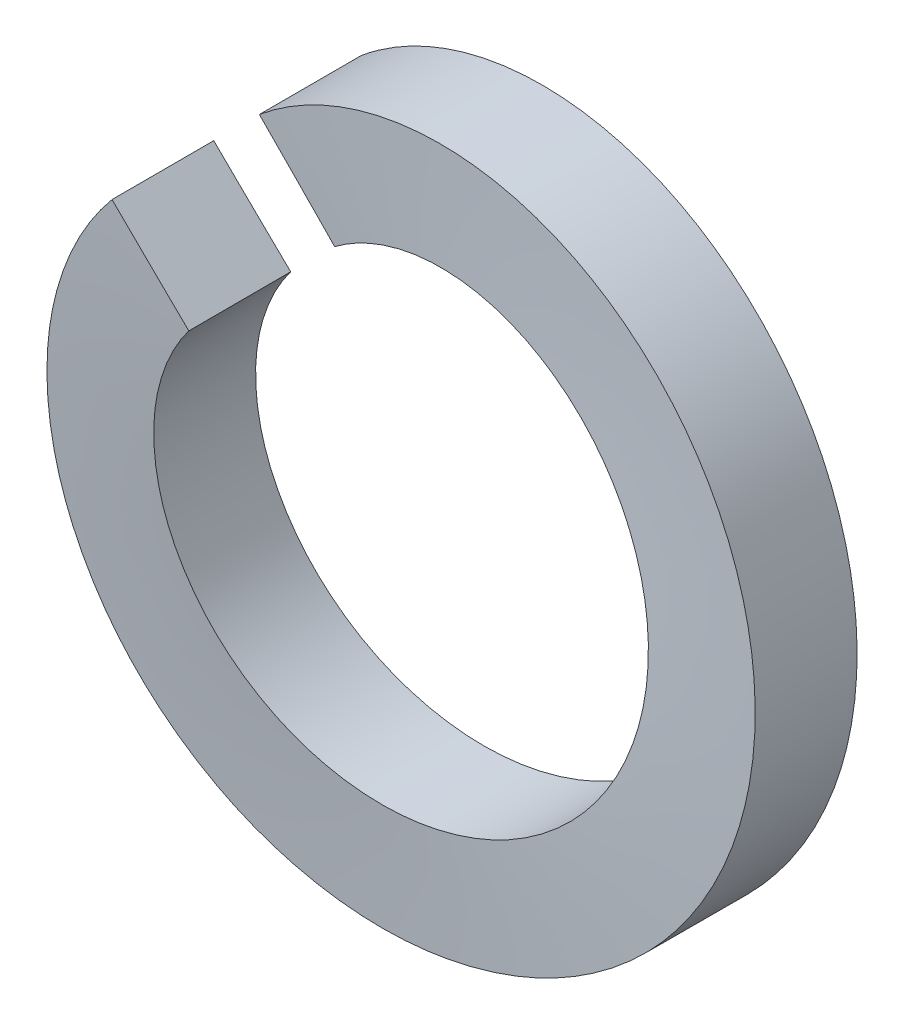
ISO-10303-21;
HEADER;
FILE_DESCRIPTION(('STEP AP214'),'2;1');
FILE_NAME('part.step','',(''),(''),'','','');
FILE_SCHEMA(('AUTOMOTIVE_DESIGN { 1 0 10303 214 1 1 1 1 }'));
ENDSEC;
DATA;
#1=APPLICATION_CONTEXT('core data for automotive mechanical design processes');
#2=APPLICATION_PROTOCOL_DEFINITION('international standard','automotive_design',2000,#1);
#3=PRODUCT_CONTEXT('',#1,'mechanical');
#4=PRODUCT('Part','Part','',(#3));
#5=PRODUCT_RELATED_PRODUCT_CATEGORY('part','',(#4));
#6=PRODUCT_DEFINITION_FORMATION('','',#4);
#7=PRODUCT_DEFINITION_CONTEXT('part definition',#1,'design');
#8=PRODUCT_DEFINITION('design','',#6,#7);
#9=PRODUCT_DEFINITION_SHAPE('','',#8);
#10=(LENGTH_UNIT() NAMED_UNIT(*) SI_UNIT(.MILLI.,.METRE.));
#11=(NAMED_UNIT(*) PLANE_ANGLE_UNIT() SI_UNIT($,.RADIAN.));
#12=(NAMED_UNIT(*) SI_UNIT($,.STERADIAN.) SOLID_ANGLE_UNIT());
#13=UNCERTAINTY_MEASURE_WITH_UNIT(LENGTH_MEASURE(1.E-05),#10,'distance_accuracy_value','');
#14=(GEOMETRIC_REPRESENTATION_CONTEXT(3) GLOBAL_UNCERTAINTY_ASSIGNED_CONTEXT((#13)) GLOBAL_UNIT_ASSIGNED_CONTEXT((#10,
#11,#12)) REPRESENTATION_CONTEXT('',''));
#15=CARTESIAN_POINT('',(0.,0.,0.));
#16=DIRECTION('',(0.,0.,1.));
#17=DIRECTION('',(1.,0.,0.));
#18=AXIS2_PLACEMENT_3D('',#15,#16,#17);
#19=CARTESIAN_POINT('',(-12.9046987566544,12.9046987566546,6.3));
#20=CARTESIAN_POINT('',(-15.8501120368315,9.95928547647756,6.075));
#21=CARTESIAN_POINT('',(-17.2258707781276,6.02759288068195,5.85));
#22=CARTESIAN_POINT('',(-18.6016295194238,2.09590028488634,5.625));
#23=CARTESIAN_POINT('',(-18.1352478305517,-2.04335168888521,5.4));
#24=CARTESIAN_POINT('',(-17.6688661416795,-6.18260366265676,5.175));
#25=CARTESIAN_POINT('',(-15.4527166359163,-9.70958539640476,4.95));
#26=CARTESIAN_POINT('',(-13.236567130153,-13.2365671301528,4.725));
#27=CARTESIAN_POINT('',(-9.70958539640502,-15.4527166359161,4.5));
#28=CARTESIAN_POINT('',(-6.18260366265706,-17.6688661416794,4.275));
#29=CARTESIAN_POINT('',(-2.04335168888553,-18.1352478305517,4.05));
#30=CARTESIAN_POINT('',(2.09590028488601,-18.6016295194239,3.825));
#31=CARTESIAN_POINT('',(6.02759288068165,-17.2258707781278,3.6));
#32=CARTESIAN_POINT('',(9.95928547647728,-15.8501120368316,3.375));
#33=CARTESIAN_POINT('',(12.9046987566544,-12.9046987566546,3.15));
#34=CARTESIAN_POINT('',(15.8501120368315,-9.95928547647756,2.925));
#35=CARTESIAN_POINT('',(17.2258707781276,-6.02759288068195,2.7));
#36=CARTESIAN_POINT('',(18.6016295194238,-2.09590028488634,2.475));
#37=CARTESIAN_POINT('',(18.1352478305517,2.04335168888521,2.25));
#38=CARTESIAN_POINT('',(17.6688661416795,6.18260366265675,2.025));
#39=CARTESIAN_POINT('',(15.4527166359163,9.70958539640475,1.8));
#40=CARTESIAN_POINT('',(13.236567130153,13.2365671301528,1.575));
#41=CARTESIAN_POINT('',(9.70958539640502,15.4527166359161,1.35));
#42=CARTESIAN_POINT('',(6.18260366265707,17.6688661416794,1.125));
#43=CARTESIAN_POINT('',(2.04335168888553,18.1352478305517,0.899999999999999));
#44=CARTESIAN_POINT('',(-2.09590028488601,18.6016295194239,0.674999999999999));
#45=CARTESIAN_POINT('',(-6.02759288068165,17.2258707781278,0.449999999999999));
#46=CARTESIAN_POINT('',(-9.95928547647728,15.8501120368316,0.225));
#47=CARTESIAN_POINT('',(-12.9046987566544,12.9046987566546,0.));
#48=CARTESIAN_POINT('',(-8.66205806953513,8.66205806953528,6.3));
#49=CARTESIAN_POINT('',(-10.6391162986951,6.68499984037535,6.075));
#50=CARTESIAN_POINT('',(-11.5625707962775,4.0459185089509,5.85));
#51=CARTESIAN_POINT('',(-12.4860252938598,1.40683717752645,5.625));
#52=CARTESIAN_POINT('',(-12.1729745711922,-1.37156483226541,5.4));
#53=CARTESIAN_POINT('',(-11.8599238485246,-4.14996684205727,5.175));
#54=CARTESIAN_POINT('',(-10.3723714405465,-6.51739293731278,4.95));
#55=CARTESIAN_POINT('',(-8.88481903256844,-8.88481903256828,4.725));
#56=CARTESIAN_POINT('',(-6.51739293731296,-10.3723714405464,4.5));
#57=CARTESIAN_POINT('',(-4.14996684205748,-11.8599238485246,4.275));
#58=CARTESIAN_POINT('',(-1.37156483226563,-12.1729745711922,4.05));
#59=CARTESIAN_POINT('',(1.40683717752622,-12.4860252938599,3.825));
#60=CARTESIAN_POINT('',(4.04591850895069,-11.5625707962775,3.6));
#61=CARTESIAN_POINT('',(6.68499984037516,-10.6391162986952,3.375));
#62=CARTESIAN_POINT('',(8.66205806953512,-8.66205806953528,3.15));
#63=CARTESIAN_POINT('',(10.6391162986951,-6.68499984037535,2.925));
#64=CARTESIAN_POINT('',(11.5625707962775,-4.0459185089509,2.7));
#65=CARTESIAN_POINT('',(12.4860252938598,-1.40683717752645,2.475));
#66=CARTESIAN_POINT('',(12.1729745711922,1.37156483226541,2.25));
#67=CARTESIAN_POINT('',(11.8599238485246,4.14996684205727,2.025));
#68=CARTESIAN_POINT('',(10.3723714405465,6.51739293731278,1.8));
#69=CARTESIAN_POINT('',(8.88481903256844,8.88481903256828,1.575));
#70=CARTESIAN_POINT('',(6.51739293731296,10.3723714405464,1.35));
#71=CARTESIAN_POINT('',(4.14996684205748,11.8599238485246,1.125));
#72=CARTESIAN_POINT('',(1.37156483226563,12.1729745711922,0.9));
#73=CARTESIAN_POINT('',(-1.40683717752622,12.4860252938599,0.675));
#74=CARTESIAN_POINT('',(-4.04591850895069,11.5625707962775,0.45));
#75=CARTESIAN_POINT('',(-6.68499984037516,10.6391162986952,0.225));
#76=CARTESIAN_POINT('',(-8.66205806953513,8.66205806953528,0.));
#77=(BOUNDED_SURFACE() B_SPLINE_SURFACE(1,2,((#19,#20,#21,#22,#23,#24,#25,#26,#27,#28,#29,#30,
#31,#32,#33,#34,#35,#36,#37,#38,#39,#40,#41,#42,#43,#44,#45,#46,#47),(#48,#49,#50,#51,#52,#53,
#54,#55,#56,#57,#58,#59,#60,#61,#62,#63,#64,#65,#66,#67,#68,#69,#70,#71,#72,#73,#74,#75,#76)),
.UNSPECIFIED.,.F.,.F.,.F.) B_SPLINE_SURFACE_WITH_KNOTS((2,2),(3,2,2,2,2,2,2,2,2,2,2,2,2,2,3),
(0.,0.256410256410256),(0.,0.0714285714285714,0.142857142857143,0.214285714285714,
0.285714285714286,0.357142857142857,0.428571428571429,0.5,0.571428571428571,0.642857142857143,
0.714285714285714,0.785714285714286,0.857142857142857,0.928571428571429,1.),
.UNSPECIFIED.) GEOMETRIC_REPRESENTATION_ITEM() RATIONAL_B_SPLINE_SURFACE(((1.,0.974927912181824,
1.,0.974927912181824,1.,0.974927912181824,1.,0.974927912181824,1.,0.974927912181824,1.,
0.974927912181824,1.,0.974927912181824,1.,0.974927912181824,1.,0.974927912181824,1.,
0.974927912181824,1.,0.974927912181824,1.,0.974927912181824,1.,0.974927912181824,1.,
0.974927912181824,1.),(1.,0.974927912181824,1.,0.974927912181824,1.,0.974927912181824,1.,
0.974927912181824,1.,0.974927912181824,1.,0.974927912181824,1.,0.974927912181824,1.,
0.974927912181824,1.,0.974927912181824,1.,0.974927912181824,1.,0.974927912181824,1.,
0.974927912181824,1.,0.974927912181824,1.,0.974927912181824,1.))) REPRESENTATION_ITEM('') SURFACE());
#78=CARTESIAN_POINT('',(-8.66205806953513,8.66205806953528,6.3));
#79=CARTESIAN_POINT('',(-10.6391162986951,6.68499984037535,6.075));
#80=CARTESIAN_POINT('',(-11.5625707962775,4.0459185089509,5.85));
#81=CARTESIAN_POINT('',(-12.4860252938598,1.40683717752645,5.625));
#82=CARTESIAN_POINT('',(-12.1729745711922,-1.37156483226541,5.4));
#83=CARTESIAN_POINT('',(-11.8599238485246,-4.14996684205727,5.175));
#84=CARTESIAN_POINT('',(-10.3723714405465,-6.51739293731278,4.95));
#85=CARTESIAN_POINT('',(-8.88481903256844,-8.88481903256828,4.725));
#86=CARTESIAN_POINT('',(-6.51739293731296,-10.3723714405464,4.5));
#87=CARTESIAN_POINT('',(-4.14996684205748,-11.8599238485246,4.275));
#88=CARTESIAN_POINT('',(-1.37156483226563,-12.1729745711922,4.05));
#89=CARTESIAN_POINT('',(1.40683717752622,-12.4860252938599,3.825));
#90=CARTESIAN_POINT('',(4.04591850895069,-11.5625707962775,3.6));
#91=CARTESIAN_POINT('',(6.68499984037516,-10.6391162986952,3.375));
#92=CARTESIAN_POINT('',(8.66205806953512,-8.66205806953528,3.15));
#93=CARTESIAN_POINT('',(10.6391162986951,-6.68499984037535,2.925));
#94=CARTESIAN_POINT('',(11.5625707962775,-4.0459185089509,2.7));
#95=CARTESIAN_POINT('',(12.4860252938598,-1.40683717752645,2.475));
#96=CARTESIAN_POINT('',(12.1729745711922,1.37156483226541,2.25));
#97=CARTESIAN_POINT('',(11.8599238485246,4.14996684205727,2.025));
#98=CARTESIAN_POINT('',(10.3723714405465,6.51739293731278,1.8));
#99=CARTESIAN_POINT('',(8.88481903256844,8.88481903256828,1.575));
#100=CARTESIAN_POINT('',(6.51739293731296,10.3723714405464,1.35));
#101=CARTESIAN_POINT('',(4.14996684205748,11.8599238485246,1.125));
#102=CARTESIAN_POINT('',(1.37156483226563,12.1729745711922,0.9));
#103=CARTESIAN_POINT('',(-1.40683717752622,12.4860252938599,0.675));
#104=CARTESIAN_POINT('',(-4.04591850895069,11.5625707962775,0.45));
#105=CARTESIAN_POINT('',(-6.68499984037516,10.6391162986952,0.225));
#106=CARTESIAN_POINT('',(-8.66205806953513,8.66205806953528,0.));
#107=(BOUNDED_CURVE() B_SPLINE_CURVE(2,(#78,#79,#80,#81,#82,#83,#84,#85,#86,#87,#88,#89,#90,#91,
#92,#93,#94,#95,#96,#97,#98,#99,#100,#101,#102,#103,#104,#105,#106),.UNSPECIFIED.,.F.,
.F.) B_SPLINE_CURVE_WITH_KNOTS((3,2,2,2,2,2,2,2,2,2,2,2,2,2,3),(0.,0.0714285714285714,
0.142857142857143,0.214285714285714,0.285714285714286,0.357142857142857,0.428571428571429,0.5,
0.571428571428571,0.642857142857143,0.714285714285714,0.785714285714286,0.857142857142857,
0.928571428571429,1.),
.UNSPECIFIED.) CURVE() GEOMETRIC_REPRESENTATION_ITEM() RATIONAL_B_SPLINE_CURVE((1.,
0.974927912181824,1.,0.974927912181824,1.,0.974927912181824,1.,0.974927912181824,1.,
0.974927912181824,1.,0.974927912181824,1.,0.974927912181824,1.,0.974927912181824,1.,
0.974927912181824,1.,0.974927912181824,1.,0.974927912181824,1.,0.974927912181824,1.,
0.974927912181824,1.,0.974927912181824,1.)) REPRESENTATION_ITEM(''));
#108=CARTESIAN_POINT('',(-9.65753460380452,7.53621426024487,6.17759792475585));
#109=VERTEX_POINT('',#108);
#110=CARTESIAN_POINT('',(-7.53621426024487,9.65753460380451,0.122402075244133));
#111=VERTEX_POINT('',#110);
#112=EDGE_CURVE('E52',#109,#111,#107,.T.);
#113=CARTESIAN_POINT('',(-9.65753460380452,7.53621426024487,6.17759792475585));
#114=CARTESIAN_POINT('',(-10.0201626185838,7.89884227502415,6.18273019748663));
#115=CARTESIAN_POINT('',(-10.3827944525156,8.26147410895596,6.18726637702038));
#116=CARTESIAN_POINT('',(-11.1080632384221,8.98674289486242,6.19541822317271));
#117=CARTESIAN_POINT('',(-11.4707001903951,9.34937984683546,6.19903389007709));
#118=CARTESIAN_POINT('',(-12.1813962576839,10.0600759141242,6.20548405553128));
#119=CARTESIAN_POINT('',(-12.5294552617778,10.4081349182182,6.20834411749943));
#120=CARTESIAN_POINT('',(-13.2255747812567,11.104254437697,6.2135971687636));
#121=CARTESIAN_POINT('',(-13.5736352966402,11.4523149530806,6.21599015841606));
#122=CARTESIAN_POINT('',(-13.9216962886718,11.8003759451122,6.21821493248272));
#123=B_SPLINE_CURVE_WITH_KNOTS('',3,(#113,#114,#115,#116,#117,#118,#119,#120,#121,#122),
.UNSPECIFIED.,.F.,.F.,(4,2,2,2,4),(0.,1.53857626231134,3.07715204690481,4.55386606482436,
6.03057895579324),.UNSPECIFIED.);
#124=CARTESIAN_POINT('',(-13.9216962886718,11.8003759451122,6.21821493248272));
#125=VERTEX_POINT('',#124);
#126=EDGE_CURVE('E109',#109,#125,#123,.T.);
#127=CARTESIAN_POINT('',(-12.9046987566544,12.9046987566546,6.3));
#128=CARTESIAN_POINT('',(-15.8501120368315,9.95928547647756,6.075));
#129=CARTESIAN_POINT('',(-17.2258707781276,6.02759288068195,5.85));
#130=CARTESIAN_POINT('',(-18.6016295194238,2.09590028488634,5.625));
#131=CARTESIAN_POINT('',(-18.1352478305517,-2.04335168888521,5.4));
#132=CARTESIAN_POINT('',(-17.6688661416795,-6.18260366265676,5.175));
#133=CARTESIAN_POINT('',(-15.4527166359163,-9.70958539640476,4.95));
#134=CARTESIAN_POINT('',(-13.236567130153,-13.2365671301528,4.725));
#135=CARTESIAN_POINT('',(-9.70958539640502,-15.4527166359161,4.5));
#136=CARTESIAN_POINT('',(-6.18260366265706,-17.6688661416794,4.275));
#137=CARTESIAN_POINT('',(-2.04335168888553,-18.1352478305517,4.05));
#138=CARTESIAN_POINT('',(2.09590028488601,-18.6016295194239,3.825));
#139=CARTESIAN_POINT('',(6.02759288068165,-17.2258707781278,3.6));
#140=CARTESIAN_POINT('',(9.95928547647728,-15.8501120368316,3.375));
#141=CARTESIAN_POINT('',(12.9046987566544,-12.9046987566546,3.15));
#142=CARTESIAN_POINT('',(15.8501120368315,-9.95928547647756,2.925));
#143=CARTESIAN_POINT('',(17.2258707781276,-6.02759288068195,2.7));
#144=CARTESIAN_POINT('',(18.6016295194238,-2.09590028488634,2.475));
#145=CARTESIAN_POINT('',(18.1352478305517,2.04335168888521,2.25));
#146=CARTESIAN_POINT('',(17.6688661416795,6.18260366265675,2.025));
#147=CARTESIAN_POINT('',(15.4527166359163,9.70958539640475,1.8));
#148=CARTESIAN_POINT('',(13.236567130153,13.2365671301528,1.575));
#149=CARTESIAN_POINT('',(9.70958539640502,15.4527166359161,1.35));
#150=CARTESIAN_POINT('',(6.18260366265707,17.6688661416794,1.125));
#151=CARTESIAN_POINT('',(2.04335168888553,18.1352478305517,0.899999999999999));
#152=CARTESIAN_POINT('',(-2.09590028488601,18.6016295194239,0.674999999999999));
#153=CARTESIAN_POINT('',(-6.02759288068165,17.2258707781278,0.449999999999999));
#154=CARTESIAN_POINT('',(-9.95928547647728,15.8501120368316,0.225));
#155=CARTESIAN_POINT('',(-12.9046987566544,12.9046987566546,0.));
#156=(BOUNDED_CURVE() B_SPLINE_CURVE(2,(#127,#128,#129,#130,#131,#132,#133,#134,#135,#136,#137,
#138,#139,#140,#141,#142,#143,#144,#145,#146,#147,#148,#149,#150,#151,#152,#153,#154,#155),
.UNSPECIFIED.,.F.,.F.) B_SPLINE_CURVE_WITH_KNOTS((3,2,2,2,2,2,2,2,2,2,2,2,2,2,3),(0.,
0.0714285714285714,0.142857142857143,0.214285714285714,0.285714285714286,0.357142857142857,
0.428571428571429,0.5,0.571428571428571,0.642857142857143,0.714285714285714,0.785714285714286,
0.857142857142857,0.928571428571429,1.),
.UNSPECIFIED.) CURVE() GEOMETRIC_REPRESENTATION_ITEM() RATIONAL_B_SPLINE_CURVE((1.,
0.974927912181824,1.,0.974927912181824,1.,0.974927912181824,1.,0.974927912181824,1.,
0.974927912181824,1.,0.974927912181824,1.,0.974927912181824,1.,0.974927912181824,1.,
0.974927912181824,1.,0.974927912181824,1.,0.974927912181824,1.,0.974927912181824,1.,
0.974927912181824,1.,0.974927912181824,1.)) REPRESENTATION_ITEM(''));
#157=CARTESIAN_POINT('',(-11.8003759451121,13.9216962886718,0.0817850675172687));
#158=VERTEX_POINT('',#157);
#159=EDGE_CURVE('E107',#125,#158,#156,.T.);
#160=CARTESIAN_POINT('',(-11.8003759451122,13.9216962886718,0.0817850675172652));
#161=CARTESIAN_POINT('',(-11.4377339800159,13.5590543235756,0.0841045315764204));
#162=CARTESIAN_POINT('',(-11.0750925055633,13.196412849123,0.0866044232967273));
#163=CARTESIAN_POINT('',(-10.3498115016624,12.471131845222,0.0921172383524553));
#164=CARTESIAN_POINT('',(-9.98717197221422,12.1084923157739,0.0951301617199858));
#165=CARTESIAN_POINT('',(-9.27647663980695,11.3977969833666,0.101686700799431));
#166=CARTESIAN_POINT('',(-8.92842072045813,11.0497410640178,0.105204107871125));
#167=CARTESIAN_POINT('',(-8.23231343468733,10.353633778247,0.113097605846447));
#168=CARTESIAN_POINT('',(-7.88426206827054,10.0055824118302,0.117473697653337));
#169=CARTESIAN_POINT('',(-7.53621426024487,9.65753460380452,0.122402075244134));
#170=B_SPLINE_CURVE_WITH_KNOTS('',3,(#160,#161,#162,#163,#164,#165,#166,#167,#168,#169),
.UNSPECIFIED.,.F.,.F.,(4,2,2,2,4),(0.,1.53857542804319,3.07715095238217,4.55386418909776,
6.03057897919404),.UNSPECIFIED.);
#171=EDGE_CURVE('E66',#158,#111,#170,.T.);
#172=ORIENTED_EDGE('',*,*,#112,.F.);
#173=ORIENTED_EDGE('',*,*,#126,.T.);
#174=ORIENTED_EDGE('',*,*,#159,.T.);
#175=ORIENTED_EDGE('',*,*,#171,.T.);
#176=EDGE_LOOP('',(#172,#173,#174,#175));
#177=FACE_BOUND('',#176,.T.);
#178=ADVANCED_FACE('F46',(#177),#77,.F.);
#179=CARTESIAN_POINT('',(-8.66205806953513,8.66205806953528,6.3));
#180=CARTESIAN_POINT('',(-10.6391162986951,6.68499984037535,6.075));
#181=CARTESIAN_POINT('',(-11.5625707962775,4.0459185089509,5.85));
#182=CARTESIAN_POINT('',(-12.4860252938598,1.40683717752645,5.625));
#183=CARTESIAN_POINT('',(-12.1729745711922,-1.37156483226541,5.4));
#184=CARTESIAN_POINT('',(-11.8599238485246,-4.14996684205727,5.175));
#185=CARTESIAN_POINT('',(-10.3723714405465,-6.51739293731278,4.95));
#186=CARTESIAN_POINT('',(-8.88481903256844,-8.88481903256828,4.725));
#187=CARTESIAN_POINT('',(-6.51739293731296,-10.3723714405464,4.5));
#188=CARTESIAN_POINT('',(-4.14996684205748,-11.8599238485246,4.275));
#189=CARTESIAN_POINT('',(-1.37156483226563,-12.1729745711922,4.05));
#190=CARTESIAN_POINT('',(1.40683717752622,-12.4860252938599,3.825));
#191=CARTESIAN_POINT('',(4.04591850895069,-11.5625707962775,3.6));
#192=CARTESIAN_POINT('',(6.68499984037516,-10.6391162986952,3.375));
#193=CARTESIAN_POINT('',(8.66205806953512,-8.66205806953528,3.15));
#194=CARTESIAN_POINT('',(10.6391162986951,-6.68499984037535,2.925));
#195=CARTESIAN_POINT('',(11.5625707962775,-4.0459185089509,2.7));
#196=CARTESIAN_POINT('',(12.4860252938598,-1.40683717752645,2.475));
#197=CARTESIAN_POINT('',(12.1729745711922,1.37156483226541,2.25));
#198=CARTESIAN_POINT('',(11.8599238485246,4.14996684205727,2.025));
#199=CARTESIAN_POINT('',(10.3723714405465,6.51739293731278,1.8));
#200=CARTESIAN_POINT('',(8.88481903256844,8.88481903256828,1.575));
#201=CARTESIAN_POINT('',(6.51739293731296,10.3723714405464,1.35));
#202=CARTESIAN_POINT('',(4.14996684205748,11.8599238485246,1.125));
#203=CARTESIAN_POINT('',(1.37156483226563,12.1729745711922,0.9));
#204=CARTESIAN_POINT('',(-1.40683717752622,12.4860252938599,0.675));
#205=CARTESIAN_POINT('',(-4.04591850895069,11.5625707962775,0.45));
#206=CARTESIAN_POINT('',(-6.68499984037516,10.6391162986952,0.225));
#207=CARTESIAN_POINT('',(-8.66205806953513,8.66205806953528,0.));
#208=CARTESIAN_POINT('',(-8.33325603120936,8.99086010786103,0.618998465130849));
#209=CARTESIAN_POINT('',(-10.3853611799834,7.08884879831514,0.393998465130849));
#210=CARTESIAN_POINT('',(-11.4089922538613,4.48482076700352,0.168998465130849));
#211=CARTESIAN_POINT('',(-12.4326233277393,1.8807927356919,-0.0560015348691513));
#212=CARTESIAN_POINT('',(-12.2250376385285,-0.9094923294762,-0.281001534869151));
#213=CARTESIAN_POINT('',(-12.0174519493176,-3.6997773946443,-0.506001534869151));
#214=CARTESIAN_POINT('',(-10.6197643886376,-6.12366931591173,-0.731001534869151));
#215=CARTESIAN_POINT('',(-9.22207682795755,-8.54756123717916,-0.956001534869151));
#216=CARTESIAN_POINT('',(-6.911116558714,-10.1249784924553,-1.18100153486915));
#217=CARTESIAN_POINT('',(-4.60015628947046,-11.7023957477315,-1.40600153486915));
#218=CARTESIAN_POINT('',(-1.83363733505484,-12.1209115038559,-1.63100153486915));
#219=CARTESIAN_POINT('',(0.932881619360775,-12.5394272599803,-1.85600153486915));
#220=CARTESIAN_POINT('',(3.60701625089807,-11.7161493386936,-2.08100153486915));
#221=CARTESIAN_POINT('',(6.28115088243536,-10.8928714174069,-2.30600153486915));
#222=CARTESIAN_POINT('',(8.33325603120936,-8.99086010786103,-2.53100153486915));
#223=CARTESIAN_POINT('',(10.3853611799834,-7.08884879831514,-2.75600153486915));
#224=CARTESIAN_POINT('',(11.4089922538613,-4.48482076700352,-2.98100153486915));
#225=CARTESIAN_POINT('',(12.4326233277393,-1.8807927356919,-3.20600153486915));
#226=CARTESIAN_POINT('',(12.2250376385285,0.909492329476199,-3.43100153486915));
#227=CARTESIAN_POINT('',(12.0174519493176,3.69977739464429,-3.65600153486915));
#228=CARTESIAN_POINT('',(10.6197643886376,6.12366931591173,-3.88100153486915));
#229=CARTESIAN_POINT('',(9.22207682795756,8.54756123717916,-4.10600153486915));
#230=CARTESIAN_POINT('',(6.911116558714,10.1249784924553,-4.33100153486915));
#231=CARTESIAN_POINT('',(4.60015628947046,11.7023957477315,-4.55600153486915));
#232=CARTESIAN_POINT('',(1.83363733505484,12.1209115038559,-4.78100153486915));
#233=CARTESIAN_POINT('',(-0.932881619360774,12.5394272599803,-5.00600153486915));
#234=CARTESIAN_POINT('',(-3.60701625089807,11.7161493386936,-5.23100153486915));
#235=CARTESIAN_POINT('',(-6.28115088243536,10.8928714174069,-5.45600153486915));
#236=CARTESIAN_POINT('',(-8.33325603120936,8.99086010786103,-5.68100153486915));
#237=(BOUNDED_SURFACE() B_SPLINE_SURFACE(1,2,((#179,#180,#181,#182,#183,#184,#185,#186,#187,
#188,#189,#190,#191,#192,#193,#194,#195,#196,#197,#198,#199,#200,#201,#202,#203,#204,#205,#206,
#207),(#208,#209,#210,#211,#212,#213,#214,#215,#216,#217,#218,#219,#220,#221,#222,#223,#224,
#225,#226,#227,#228,#229,#230,#231,#232,#233,#234,#235,#236)),.UNSPECIFIED.,.F.,.F.,
.F.) B_SPLINE_SURFACE_WITH_KNOTS((2,2),(3,2,2,2,2,2,2,2,2,2,2,2,2,2,3),(0.256410256410256,0.5),
(0.,0.0714285714285714,0.142857142857143,0.214285714285714,0.285714285714286,0.357142857142857,
0.428571428571429,0.5,0.571428571428571,0.642857142857143,0.714285714285714,0.785714285714286,
0.857142857142857,0.928571428571429,1.),
.UNSPECIFIED.) GEOMETRIC_REPRESENTATION_ITEM() RATIONAL_B_SPLINE_SURFACE(((1.,0.974927912181824,
1.,0.974927912181824,1.,0.974927912181824,1.,0.974927912181824,1.,0.974927912181824,1.,
0.974927912181824,1.,0.974927912181824,1.,0.974927912181824,1.,0.974927912181824,1.,
0.974927912181824,1.,0.974927912181824,1.,0.974927912181824,1.,0.974927912181824,1.,
0.974927912181824,1.),(1.,0.974927912181824,1.,0.974927912181824,1.,0.974927912181824,1.,
0.974927912181824,1.,0.974927912181824,1.,0.974927912181824,1.,0.974927912181824,1.,
0.974927912181824,1.,0.974927912181824,1.,0.974927912181824,1.,0.974927912181824,1.,
0.974927912181824,1.,0.974927912181824,1.,0.974927912181824,1.))) REPRESENTATION_ITEM('') SURFACE());
#238=CARTESIAN_POINT('',(-8.33325603120936,8.99086010786103,0.618998465130849));
#239=CARTESIAN_POINT('',(-10.3853611799834,7.08884879831514,0.393998465130849));
#240=CARTESIAN_POINT('',(-11.4089922538613,4.48482076700352,0.168998465130849));
#241=CARTESIAN_POINT('',(-12.4326233277393,1.8807927356919,-0.0560015348691513));
#242=CARTESIAN_POINT('',(-12.2250376385285,-0.9094923294762,-0.281001534869151));
#243=CARTESIAN_POINT('',(-12.0174519493176,-3.6997773946443,-0.506001534869151));
#244=CARTESIAN_POINT('',(-10.6197643886376,-6.12366931591173,-0.731001534869151));
#245=CARTESIAN_POINT('',(-9.22207682795755,-8.54756123717916,-0.956001534869151));
#246=CARTESIAN_POINT('',(-6.911116558714,-10.1249784924553,-1.18100153486915));
#247=CARTESIAN_POINT('',(-4.60015628947046,-11.7023957477315,-1.40600153486915));
#248=CARTESIAN_POINT('',(-1.83363733505484,-12.1209115038559,-1.63100153486915));
#249=CARTESIAN_POINT('',(0.932881619360775,-12.5394272599803,-1.85600153486915));
#250=CARTESIAN_POINT('',(3.60701625089807,-11.7161493386936,-2.08100153486915));
#251=CARTESIAN_POINT('',(6.28115088243536,-10.8928714174069,-2.30600153486915));
#252=CARTESIAN_POINT('',(8.33325603120936,-8.99086010786103,-2.53100153486915));
#253=CARTESIAN_POINT('',(10.3853611799834,-7.08884879831514,-2.75600153486915));
#254=CARTESIAN_POINT('',(11.4089922538613,-4.48482076700352,-2.98100153486915));
#255=CARTESIAN_POINT('',(12.4326233277393,-1.8807927356919,-3.20600153486915));
#256=CARTESIAN_POINT('',(12.2250376385285,0.909492329476199,-3.43100153486915));
#257=CARTESIAN_POINT('',(12.0174519493176,3.69977739464429,-3.65600153486915));
#258=CARTESIAN_POINT('',(10.6197643886376,6.12366931591173,-3.88100153486915));
#259=CARTESIAN_POINT('',(9.22207682795756,8.54756123717916,-4.10600153486915));
#260=CARTESIAN_POINT('',(6.911116558714,10.1249784924553,-4.33100153486915));
#261=CARTESIAN_POINT('',(4.60015628947046,11.7023957477315,-4.55600153486915));
#262=CARTESIAN_POINT('',(1.83363733505484,12.1209115038559,-4.78100153486915));
#263=CARTESIAN_POINT('',(-0.932881619360774,12.5394272599803,-5.00600153486915));
#264=CARTESIAN_POINT('',(-3.60701625089807,11.7161493386936,-5.23100153486915));
#265=CARTESIAN_POINT('',(-6.28115088243536,10.8928714174069,-5.45600153486915));
#266=CARTESIAN_POINT('',(-8.33325603120936,8.99086010786103,-5.68100153486915));
#267=(BOUNDED_CURVE() B_SPLINE_CURVE(2,(#238,#239,#240,#241,#242,#243,#244,#245,#246,#247,#248,
#249,#250,#251,#252,#253,#254,#255,#256,#257,#258,#259,#260,#261,#262,#263,#264,#265,#266),
.UNSPECIFIED.,.F.,.F.) B_SPLINE_CURVE_WITH_KNOTS((3,2,2,2,2,2,2,2,2,2,2,2,2,2,3),(0.,
0.0714285714285714,0.142857142857143,0.214285714285714,0.285714285714286,0.357142857142857,
0.428571428571429,0.5,0.571428571428571,0.642857142857143,0.714285714285714,0.785714285714286,
0.857142857142857,0.928571428571429,1.),
.UNSPECIFIED.) CURVE() GEOMETRIC_REPRESENTATION_ITEM() RATIONAL_B_SPLINE_CURVE((1.,
0.974927912181824,1.,0.974927912181824,1.,0.974927912181824,1.,0.974927912181824,1.,
0.974927912181824,1.,0.974927912181824,1.,0.974927912181824,1.,0.974927912181824,1.,
0.974927912181824,1.,0.974927912181824,1.,0.974927912181824,1.,0.974927912181824,1.,
0.974927912181824,1.,0.974927912181824,1.)) REPRESENTATION_ITEM(''));
#268=CARTESIAN_POINT('',(-9.6638201017362,7.54249975817656,0.45845594869544));
#269=VERTEX_POINT('',#268);
#270=CARTESIAN_POINT('',(-7.54249975817656,9.6638201017362,-5.5967707305064));
#271=VERTEX_POINT('',#270);
#272=EDGE_CURVE('E103',#269,#271,#267,.T.);
#273=CARTESIAN_POINT('',(-9.6638201017362,7.54249975817656,0.45845594869544));
#274=CARTESIAN_POINT('',(-9.66277286413735,7.5414525205777,0.935048850950928));
#275=CARTESIAN_POINT('',(-9.66185638889622,7.54053604533658,1.41164233943497));
#276=CARTESIAN_POINT('',(-9.65989229109634,7.5385719475367,2.60312808533235));
#277=CARTESIAN_POINT('',(-9.65900821522057,7.53768787166092,3.31802089037357));
#278=CARTESIAN_POINT('',(-9.65782933154418,7.53650898798454,4.74780844324174));
#279=CARTESIAN_POINT('',(-9.65753452454411,7.53621418098447,5.46270319107002));
#280=CARTESIAN_POINT('',(-9.65753460380452,7.53621426024487,6.17759792475585));
#281=B_SPLINE_CURVE_WITH_KNOTS('',3,(#273,#274,#275,#276,#277,#278,#279,#280),.UNSPECIFIED.,.F.,
.F.,(4,2,2,4),(0.,1.42978560409326,3.5744667985504,5.71915090660722),.UNSPECIFIED.);
#282=EDGE_CURVE('E172',#269,#109,#281,.T.);
#283=CARTESIAN_POINT('',(-7.53621426024487,9.65753460380451,0.122402075244133));
#284=CARTESIAN_POINT('',(-7.53621411954245,9.65753446310208,-0.830793861458805));
#285=CARTESIAN_POINT('',(-7.53673826503064,9.65805860859028,-1.78398968800236));
#286=CARTESIAN_POINT('',(-7.53830995598512,9.65963029954476,-3.21378269066706));
#287=CARTESIAN_POINT('',(-7.5389647662368,9.66028510979644,-3.690380756973));
#288=CARTESIAN_POINT('',(-7.54053605259914,9.66185639615878,-4.6435763143289));
#289=CARTESIAN_POINT('',(-7.54145252886758,9.66277287242723,-5.12017380537834));
#290=CARTESIAN_POINT('',(-7.54249975817656,9.6638201017362,-5.5967707305064));
#291=B_SPLINE_CURVE_WITH_KNOTS('',3,(#283,#284,#285,#286,#287,#288,#289,#290),.UNSPECIFIED.,.F.,
.F.,(4,2,2,4),(0.,2.85958726682837,4.28938402991085,5.71918165517954),.UNSPECIFIED.);
#292=EDGE_CURVE('E104',#111,#271,#291,.T.);
#293=ORIENTED_EDGE('',*,*,#272,.F.);
#294=ORIENTED_EDGE('',*,*,#282,.T.);
#295=ORIENTED_EDGE('',*,*,#112,.T.);
#296=ORIENTED_EDGE('',*,*,#292,.T.);
#297=EDGE_LOOP('',(#293,#294,#295,#296));
#298=FACE_BOUND('',#297,.T.);
#299=ADVANCED_FACE('F178',(#298),#237,.F.);
#300=CARTESIAN_POINT('',(-8.33325603120936,8.99086010786103,0.618998465130849));
#301=CARTESIAN_POINT('',(-10.3853611799834,7.08884879831514,0.393998465130849));
#302=CARTESIAN_POINT('',(-11.4089922538613,4.48482076700352,0.168998465130849));
#303=CARTESIAN_POINT('',(-12.4326233277393,1.8807927356919,-0.0560015348691513));
#304=CARTESIAN_POINT('',(-12.2250376385285,-0.9094923294762,-0.281001534869151));
#305=CARTESIAN_POINT('',(-12.0174519493176,-3.6997773946443,-0.506001534869151));
#306=CARTESIAN_POINT('',(-10.6197643886376,-6.12366931591173,-0.731001534869151));
#307=CARTESIAN_POINT('',(-9.22207682795755,-8.54756123717916,-0.956001534869151));
#308=CARTESIAN_POINT('',(-6.911116558714,-10.1249784924553,-1.18100153486915));
#309=CARTESIAN_POINT('',(-4.60015628947046,-11.7023957477315,-1.40600153486915));
#310=CARTESIAN_POINT('',(-1.83363733505484,-12.1209115038559,-1.63100153486915));
#311=CARTESIAN_POINT('',(0.932881619360775,-12.5394272599803,-1.85600153486915));
#312=CARTESIAN_POINT('',(3.60701625089807,-11.7161493386936,-2.08100153486915));
#313=CARTESIAN_POINT('',(6.28115088243536,-10.8928714174069,-2.30600153486915));
#314=CARTESIAN_POINT('',(8.33325603120936,-8.99086010786103,-2.53100153486915));
#315=CARTESIAN_POINT('',(10.3853611799834,-7.08884879831514,-2.75600153486915));
#316=CARTESIAN_POINT('',(11.4089922538613,-4.48482076700352,-2.98100153486915));
#317=CARTESIAN_POINT('',(12.4326233277393,-1.8807927356919,-3.20600153486915));
#318=CARTESIAN_POINT('',(12.2250376385285,0.909492329476199,-3.43100153486915));
#319=CARTESIAN_POINT('',(12.0174519493176,3.69977739464429,-3.65600153486915));
#320=CARTESIAN_POINT('',(10.6197643886376,6.12366931591173,-3.88100153486915));
#321=CARTESIAN_POINT('',(9.22207682795756,8.54756123717916,-4.10600153486915));
#322=CARTESIAN_POINT('',(6.911116558714,10.1249784924553,-4.33100153486915));
#323=CARTESIAN_POINT('',(4.60015628947046,11.7023957477315,-4.55600153486915));
#324=CARTESIAN_POINT('',(1.83363733505484,12.1209115038559,-4.78100153486915));
#325=CARTESIAN_POINT('',(-0.932881619360774,12.5394272599803,-5.00600153486915));
#326=CARTESIAN_POINT('',(-3.60701625089807,11.7161493386936,-5.23100153486915));
#327=CARTESIAN_POINT('',(-6.28115088243536,10.8928714174069,-5.45600153486915));
#328=CARTESIAN_POINT('',(-8.33325603120936,8.99086010786103,-5.68100153486915));
#329=CARTESIAN_POINT('',(-12.5758967183286,13.2335007949804,0.618998465130848));
#330=CARTESIAN_POINT('',(-15.5963569181197,10.3631344344173,0.393998465130848));
#331=CARTESIAN_POINT('',(-17.0722922357115,6.46649513873456,0.168998465130848));
#332=CARTESIAN_POINT('',(-18.5482275533033,2.56985584305179,-0.0560015348691522));
#333=CARTESIAN_POINT('',(-18.1873108978879,-1.581279186096,-0.281001534869152));
#334=CARTESIAN_POINT('',(-17.8263942424726,-5.73241421524378,-0.506001534869152));
#335=CARTESIAN_POINT('',(-15.7001095840073,-9.31586177500371,-0.731001534869152));
#336=CARTESIAN_POINT('',(-13.5738249255421,-12.8993093347636,-0.956001534869152));
#337=CARTESIAN_POINT('',(-10.1033090178061,-15.205323687825,-1.18100153486915));
#338=CARTESIAN_POINT('',(-6.63279311007004,-17.5113380408864,-1.40600153486915));
#339=CARTESIAN_POINT('',(-2.50542419167474,-18.0831847632154,-1.63100153486915));
#340=CARTESIAN_POINT('',(1.62194472672056,-18.6550314855444,-1.85600153486915));
#341=CARTESIAN_POINT('',(5.58869062262902,-17.3794493205439,-2.08100153486915));
#342=CARTESIAN_POINT('',(9.55543651853749,-16.1038671555434,-2.30600153486915));
#343=CARTESIAN_POINT('',(12.5758967183286,-13.2335007949804,-2.53100153486915));
#344=CARTESIAN_POINT('',(15.5963569181197,-10.3631344344173,-2.75600153486915));
#345=CARTESIAN_POINT('',(17.0722922357115,-6.46649513873457,-2.98100153486915));
#346=CARTESIAN_POINT('',(18.5482275533033,-2.56985584305179,-3.20600153486915));
#347=CARTESIAN_POINT('',(18.1873108978879,1.58127918609599,-3.43100153486915));
#348=CARTESIAN_POINT('',(17.8263942424726,5.73241421524378,-3.65600153486915));
#349=CARTESIAN_POINT('',(15.7001095840073,9.3158617750037,-3.88100153486915));
#350=CARTESIAN_POINT('',(13.5738249255421,12.8993093347636,-4.10600153486915));
#351=CARTESIAN_POINT('',(10.1033090178061,15.205323687825,-4.33100153486915));
#352=CARTESIAN_POINT('',(6.63279311007004,17.5113380408864,-4.55600153486915));
#353=CARTESIAN_POINT('',(2.50542419167474,18.0831847632154,-4.78100153486915));
#354=CARTESIAN_POINT('',(-1.62194472672056,18.6550314855444,-5.00600153486915));
#355=CARTESIAN_POINT('',(-5.58869062262902,17.3794493205439,-5.23100153486915));
#356=CARTESIAN_POINT('',(-9.55543651853748,16.1038671555434,-5.45600153486915));
#357=CARTESIAN_POINT('',(-12.5758967183286,13.2335007949804,-5.68100153486915));
#358=(BOUNDED_SURFACE() B_SPLINE_SURFACE(1,2,((#300,#301,#302,#303,#304,#305,#306,#307,#308,
#309,#310,#311,#312,#313,#314,#315,#316,#317,#318,#319,#320,#321,#322,#323,#324,#325,#326,#327,
#328),(#329,#330,#331,#332,#333,#334,#335,#336,#337,#338,#339,#340,#341,#342,#343,#344,#345,
#346,#347,#348,#349,#350,#351,#352,#353,#354,#355,#356,#357)),.UNSPECIFIED.,.F.,.F.,
.F.) B_SPLINE_SURFACE_WITH_KNOTS((2,2),(3,2,2,2,2,2,2,2,2,2,2,2,2,2,3),(0.5,0.756410256410256),
(0.,0.0714285714285714,0.142857142857143,0.214285714285714,0.285714285714286,0.357142857142857,
0.428571428571429,0.5,0.571428571428571,0.642857142857143,0.714285714285714,0.785714285714286,
0.857142857142857,0.928571428571429,1.),
.UNSPECIFIED.) GEOMETRIC_REPRESENTATION_ITEM() RATIONAL_B_SPLINE_SURFACE(((1.,0.974927912181824,
1.,0.974927912181824,1.,0.974927912181824,1.,0.974927912181824,1.,0.974927912181824,1.,
0.974927912181824,1.,0.974927912181824,1.,0.974927912181824,1.,0.974927912181824,1.,
0.974927912181824,1.,0.974927912181824,1.,0.974927912181824,1.,0.974927912181824,1.,
0.974927912181824,1.),(1.,0.974927912181824,1.,0.974927912181824,1.,0.974927912181824,1.,
0.974927912181824,1.,0.974927912181824,1.,0.974927912181824,1.,0.974927912181824,1.,
0.974927912181824,1.,0.974927912181824,1.,0.974927912181824,1.,0.974927912181824,1.,
0.974927912181824,1.,0.974927912181824,1.,0.974927912181824,1.))) REPRESENTATION_ITEM('') SURFACE());
#359=CARTESIAN_POINT('',(-12.5758967183286,13.2335007949804,0.618998465130848));
#360=CARTESIAN_POINT('',(-15.5963569181197,10.3631344344173,0.393998465130848));
#361=CARTESIAN_POINT('',(-17.0722922357115,6.46649513873456,0.168998465130848));
#362=CARTESIAN_POINT('',(-18.5482275533033,2.56985584305179,-0.0560015348691522));
#363=CARTESIAN_POINT('',(-18.1873108978879,-1.581279186096,-0.281001534869152));
#364=CARTESIAN_POINT('',(-17.8263942424726,-5.73241421524378,-0.506001534869152));
#365=CARTESIAN_POINT('',(-15.7001095840073,-9.31586177500371,-0.731001534869152));
#366=CARTESIAN_POINT('',(-13.5738249255421,-12.8993093347636,-0.956001534869152));
#367=CARTESIAN_POINT('',(-10.1033090178061,-15.205323687825,-1.18100153486915));
#368=CARTESIAN_POINT('',(-6.63279311007004,-17.5113380408864,-1.40600153486915));
#369=CARTESIAN_POINT('',(-2.50542419167474,-18.0831847632154,-1.63100153486915));
#370=CARTESIAN_POINT('',(1.62194472672056,-18.6550314855444,-1.85600153486915));
#371=CARTESIAN_POINT('',(5.58869062262902,-17.3794493205439,-2.08100153486915));
#372=CARTESIAN_POINT('',(9.55543651853749,-16.1038671555434,-2.30600153486915));
#373=CARTESIAN_POINT('',(12.5758967183286,-13.2335007949804,-2.53100153486915));
#374=CARTESIAN_POINT('',(15.5963569181197,-10.3631344344173,-2.75600153486915));
#375=CARTESIAN_POINT('',(17.0722922357115,-6.46649513873457,-2.98100153486915));
#376=CARTESIAN_POINT('',(18.5482275533033,-2.56985584305179,-3.20600153486915));
#377=CARTESIAN_POINT('',(18.1873108978879,1.58127918609599,-3.43100153486915));
#378=CARTESIAN_POINT('',(17.8263942424726,5.73241421524378,-3.65600153486915));
#379=CARTESIAN_POINT('',(15.7001095840073,9.3158617750037,-3.88100153486915));
#380=CARTESIAN_POINT('',(13.5738249255421,12.8993093347636,-4.10600153486915));
#381=CARTESIAN_POINT('',(10.1033090178061,15.205323687825,-4.33100153486915));
#382=CARTESIAN_POINT('',(6.63279311007004,17.5113380408864,-4.55600153486915));
#383=CARTESIAN_POINT('',(2.50542419167474,18.0831847632154,-4.78100153486915));
#384=CARTESIAN_POINT('',(-1.62194472672056,18.6550314855444,-5.00600153486915));
#385=CARTESIAN_POINT('',(-5.58869062262902,17.3794493205439,-5.23100153486915));
#386=CARTESIAN_POINT('',(-9.55543651853748,16.1038671555434,-5.45600153486915));
#387=CARTESIAN_POINT('',(-12.5758967183286,13.2335007949804,-5.68100153486915));
#388=(BOUNDED_CURVE() B_SPLINE_CURVE(2,(#359,#360,#361,#362,#363,#364,#365,#366,#367,#368,#369,
#370,#371,#372,#373,#374,#375,#376,#377,#378,#379,#380,#381,#382,#383,#384,#385,#386,#387),
.UNSPECIFIED.,.F.,.F.) B_SPLINE_CURVE_WITH_KNOTS((3,2,2,2,2,2,2,2,2,2,2,2,2,2,3),(0.,
0.0714285714285714,0.142857142857143,0.214285714285714,0.285714285714286,0.357142857142857,
0.428571428571429,0.5,0.571428571428571,0.642857142857143,0.714285714285714,0.785714285714286,
0.857142857142857,0.928571428571429,1.),
.UNSPECIFIED.) CURVE() GEOMETRIC_REPRESENTATION_ITEM() RATIONAL_B_SPLINE_CURVE((1.,
0.974927912181824,1.,0.974927912181824,1.,0.974927912181824,1.,0.974927912181824,1.,
0.974927912181824,1.,0.974927912181824,1.,0.974927912181824,1.,0.974927912181824,1.,
0.974927912181824,1.,0.974927912181824,1.,0.974927912181824,1.,0.974927912181824,1.,
0.974927912181824,1.,0.974927912181824,1.)) REPRESENTATION_ITEM(''));
#389=CARTESIAN_POINT('',(-13.925898637522,11.8045782939619,0.511698695669036));
#390=VERTEX_POINT('',#389);
#391=CARTESIAN_POINT('',(-11.8045782939622,13.9258986375218,-5.62469178703094));
#392=VERTEX_POINT('',#391);
#393=EDGE_CURVE('E101',#390,#392,#388,.T.);
#394=CARTESIAN_POINT('',(-13.9258986375218,11.8045782939622,0.511698695669055));
#395=CARTESIAN_POINT('',(-13.5632593535247,11.441939009965,0.50865437719428));
#396=CARTESIAN_POINT('',(-13.2006209146208,11.0793005710612,0.505373305800453));
#397=CARTESIAN_POINT('',(-12.4753473830176,10.354027039458,0.498138616200677));
#398=CARTESIAN_POINT('',(-12.1127122903186,9.99139194675894,0.494184997922536));
#399=CARTESIAN_POINT('',(-11.4023629407614,9.28104259720176,0.485586718876431));
#400=CARTESIAN_POINT('',(-11.0546484792476,8.93332813568796,0.480977170833331));
#401=CARTESIAN_POINT('',(-10.3592273511167,8.23790700755706,0.47063714643868));
#402=CARTESIAN_POINT('',(-10.0115206845147,7.89020034095506,0.464906668074617));
#403=CARTESIAN_POINT('',(-9.6638201017362,7.54249975817656,0.45845594869544));
#404=B_SPLINE_CURVE_WITH_KNOTS('',3,(#394,#395,#396,#397,#398,#399,#400,#401,#402,#403),
.UNSPECIFIED.,.F.,.F.,(4,2,2,2,4),(0.,1.53857552389619,3.07715121294182,4.55244240356502,
6.02773624294258),.UNSPECIFIED.);
#405=EDGE_CURVE('E74',#390,#269,#404,.T.);
#406=CARTESIAN_POINT('',(-7.54249975817656,9.6638201017362,-5.5967707305064));
#407=CARTESIAN_POINT('',(-7.90513707658694,10.0264574201466,-5.60030133214798));
#408=CARTESIAN_POINT('',(-8.26777620445743,10.3890965480171,-5.60342125505278));
#409=CARTESIAN_POINT('',(-8.99305688349158,11.1143772270512,-5.60902727363101));
#410=CARTESIAN_POINT('',(-9.35569843465487,11.4770187782145,-5.6115133693981));
#411=CARTESIAN_POINT('',(-10.0660460214492,12.1873663650088,-5.61594605644591));
#412=CARTESIAN_POINT('',(-10.4137520032318,12.5350723467915,-5.61791065161319));
#413=CARTESIAN_POINT('',(-11.1091646796204,13.23048502318,-5.62151924436129));
#414=CARTESIAN_POINT('',(-11.4568713742261,13.5781917177857,-5.62316324205819));
#415=CARTESIAN_POINT('',(-11.8045782939622,13.9258986375218,-5.62469178703094));
#416=B_SPLINE_CURVE_WITH_KNOTS('',3,(#406,#407,#408,#409,#410,#411,#412,#413,#414,#415),
.UNSPECIFIED.,.F.,.F.,(4,2,2,2,4),(0.,1.53857575424329,3.07715128113052,4.55235450535871,
6.02755719552261),.UNSPECIFIED.);
#417=EDGE_CURVE('E90',#271,#392,#416,.T.);
#418=ORIENTED_EDGE('',*,*,#393,.F.);
#419=ORIENTED_EDGE('',*,*,#405,.T.);
#420=ORIENTED_EDGE('',*,*,#272,.T.);
#421=ORIENTED_EDGE('',*,*,#417,.T.);
#422=EDGE_LOOP('',(#418,#419,#420,#421));
#423=FACE_BOUND('',#422,.T.);
#424=ADVANCED_FACE('F100',(#423),#358,.F.);
#425=CARTESIAN_POINT('',(-12.5758967183286,13.2335007949804,0.618998465130848));
#426=CARTESIAN_POINT('',(-15.5963569181197,10.3631344344173,0.393998465130848));
#427=CARTESIAN_POINT('',(-17.0722922357115,6.46649513873456,0.168998465130848));
#428=CARTESIAN_POINT('',(-18.5482275533033,2.56985584305179,-0.0560015348691522));
#429=CARTESIAN_POINT('',(-18.1873108978879,-1.581279186096,-0.281001534869152));
#430=CARTESIAN_POINT('',(-17.8263942424726,-5.73241421524378,-0.506001534869152));
#431=CARTESIAN_POINT('',(-15.7001095840073,-9.31586177500371,-0.731001534869152));
#432=CARTESIAN_POINT('',(-13.5738249255421,-12.8993093347636,-0.956001534869152));
#433=CARTESIAN_POINT('',(-10.1033090178061,-15.205323687825,-1.18100153486915));
#434=CARTESIAN_POINT('',(-6.63279311007004,-17.5113380408864,-1.40600153486915));
#435=CARTESIAN_POINT('',(-2.50542419167474,-18.0831847632154,-1.63100153486915));
#436=CARTESIAN_POINT('',(1.62194472672056,-18.6550314855444,-1.85600153486915));
#437=CARTESIAN_POINT('',(5.58869062262902,-17.3794493205439,-2.08100153486915));
#438=CARTESIAN_POINT('',(9.55543651853749,-16.1038671555434,-2.30600153486915));
#439=CARTESIAN_POINT('',(12.5758967183286,-13.2335007949804,-2.53100153486915));
#440=CARTESIAN_POINT('',(15.5963569181197,-10.3631344344173,-2.75600153486915));
#441=CARTESIAN_POINT('',(17.0722922357115,-6.46649513873457,-2.98100153486915));
#442=CARTESIAN_POINT('',(18.5482275533033,-2.56985584305179,-3.20600153486915));
#443=CARTESIAN_POINT('',(18.1873108978879,1.58127918609599,-3.43100153486915));
#444=CARTESIAN_POINT('',(17.8263942424726,5.73241421524378,-3.65600153486915));
#445=CARTESIAN_POINT('',(15.7001095840073,9.3158617750037,-3.88100153486915));
#446=CARTESIAN_POINT('',(13.5738249255421,12.8993093347636,-4.10600153486915));
#447=CARTESIAN_POINT('',(10.1033090178061,15.205323687825,-4.33100153486915));
#448=CARTESIAN_POINT('',(6.63279311007004,17.5113380408864,-4.55600153486915));
#449=CARTESIAN_POINT('',(2.50542419167474,18.0831847632154,-4.78100153486915));
#450=CARTESIAN_POINT('',(-1.62194472672056,18.6550314855444,-5.00600153486915));
#451=CARTESIAN_POINT('',(-5.58869062262902,17.3794493205439,-5.23100153486915));
#452=CARTESIAN_POINT('',(-9.55543651853748,16.1038671555434,-5.45600153486915));
#453=CARTESIAN_POINT('',(-12.5758967183286,13.2335007949804,-5.68100153486915));
#454=CARTESIAN_POINT('',(-12.9046987566544,12.9046987566546,6.3));
#455=CARTESIAN_POINT('',(-15.8501120368315,9.95928547647756,6.075));
#456=CARTESIAN_POINT('',(-17.2258707781276,6.02759288068195,5.85));
#457=CARTESIAN_POINT('',(-18.6016295194238,2.09590028488634,5.625));
#458=CARTESIAN_POINT('',(-18.1352478305517,-2.04335168888521,5.4));
#459=CARTESIAN_POINT('',(-17.6688661416795,-6.18260366265676,5.175));
#460=CARTESIAN_POINT('',(-15.4527166359163,-9.70958539640476,4.95));
#461=CARTESIAN_POINT('',(-13.236567130153,-13.2365671301528,4.725));
#462=CARTESIAN_POINT('',(-9.70958539640502,-15.4527166359161,4.5));
#463=CARTESIAN_POINT('',(-6.18260366265706,-17.6688661416794,4.275));
#464=CARTESIAN_POINT('',(-2.04335168888553,-18.1352478305517,4.05));
#465=CARTESIAN_POINT('',(2.09590028488601,-18.6016295194239,3.825));
#466=CARTESIAN_POINT('',(6.02759288068165,-17.2258707781278,3.6));
#467=CARTESIAN_POINT('',(9.95928547647728,-15.8501120368316,3.375));
#468=CARTESIAN_POINT('',(12.9046987566544,-12.9046987566546,3.15));
#469=CARTESIAN_POINT('',(15.8501120368315,-9.95928547647756,2.925));
#470=CARTESIAN_POINT('',(17.2258707781276,-6.02759288068195,2.7));
#471=CARTESIAN_POINT('',(18.6016295194238,-2.09590028488634,2.475));
#472=CARTESIAN_POINT('',(18.1352478305517,2.04335168888521,2.25));
#473=CARTESIAN_POINT('',(17.6688661416795,6.18260366265675,2.025));
#474=CARTESIAN_POINT('',(15.4527166359163,9.70958539640475,1.8));
#475=CARTESIAN_POINT('',(13.236567130153,13.2365671301528,1.575));
#476=CARTESIAN_POINT('',(9.70958539640502,15.4527166359161,1.35));
#477=CARTESIAN_POINT('',(6.18260366265707,17.6688661416794,1.125));
#478=CARTESIAN_POINT('',(2.04335168888553,18.1352478305517,0.9));
#479=CARTESIAN_POINT('',(-2.09590028488601,18.6016295194239,0.675));
#480=CARTESIAN_POINT('',(-6.02759288068165,17.2258707781278,0.45));
#481=CARTESIAN_POINT('',(-9.95928547647728,15.8501120368316,0.225));
#482=CARTESIAN_POINT('',(-12.9046987566544,12.9046987566546,0.));
#483=(BOUNDED_SURFACE() B_SPLINE_SURFACE(1,2,((#425,#426,#427,#428,#429,#430,#431,#432,#433,
#434,#435,#436,#437,#438,#439,#440,#441,#442,#443,#444,#445,#446,#447,#448,#449,#450,#451,#452,
#453),(#454,#455,#456,#457,#458,#459,#460,#461,#462,#463,#464,#465,#466,#467,#468,#469,#470,
#471,#472,#473,#474,#475,#476,#477,#478,#479,#480,#481,#482)),.UNSPECIFIED.,.F.,.F.,
.F.) B_SPLINE_SURFACE_WITH_KNOTS((2,2),(3,2,2,2,2,2,2,2,2,2,2,2,2,2,3),(0.756410256410256,1.),
(0.,0.0714285714285714,0.142857142857143,0.214285714285714,0.285714285714286,0.357142857142857,
0.428571428571429,0.5,0.571428571428571,0.642857142857143,0.714285714285714,0.785714285714286,
0.857142857142857,0.928571428571429,1.),
.UNSPECIFIED.) GEOMETRIC_REPRESENTATION_ITEM() RATIONAL_B_SPLINE_SURFACE(((1.,0.974927912181824,
1.,0.974927912181824,1.,0.974927912181824,1.,0.974927912181824,1.,0.974927912181824,1.,
0.974927912181824,1.,0.974927912181824,1.,0.974927912181824,1.,0.974927912181824,1.,
0.974927912181824,1.,0.974927912181824,1.,0.974927912181824,1.,0.974927912181824,1.,
0.974927912181824,1.),(1.,0.974927912181824,1.,0.974927912181824,1.,0.974927912181824,1.,
0.974927912181824,1.,0.974927912181824,1.,0.974927912181824,1.,0.974927912181824,1.,
0.974927912181824,1.,0.974927912181824,1.,0.974927912181824,1.,0.974927912181824,1.,
0.974927912181824,1.,0.974927912181824,1.,0.974927912181824,1.))) REPRESENTATION_ITEM('') SURFACE());
#484=CARTESIAN_POINT('',(-13.9216962886718,11.8003759451122,6.21821493248272));
#485=CARTESIAN_POINT('',(-13.9216962798156,11.8003759362559,5.74267189557712));
#486=CARTESIAN_POINT('',(-13.9217838491649,11.8004635056052,5.26712885369381));
#487=CARTESIAN_POINT('',(-13.9222216672545,11.8009013236948,4.07827098557241));
#488=CARTESIAN_POINT('',(-13.9226813635065,11.8013610199469,3.3649562361705));
#489=CARTESIAN_POINT('',(-13.9239946295166,11.802674285957,1.93832702746155));
#490=CARTESIAN_POINT('',(-13.9248481995148,11.8035278559552,1.22501256815495));
#491=CARTESIAN_POINT('',(-13.9258986375218,11.8045782939622,0.511698695669055));
#492=B_SPLINE_CURVE_WITH_KNOTS('',3,(#484,#485,#486,#487,#488,#489,#490,#491),.UNSPECIFIED.,.F.,
.F.,(4,2,2,4),(0.,1.42662910757255,3.56657402018693,5.70652023789229),.UNSPECIFIED.);
#493=EDGE_CURVE('E13',#125,#390,#492,.T.);
#494=CARTESIAN_POINT('',(-11.8045782939622,13.9258986375218,-5.62469178703094));
#495=CARTESIAN_POINT('',(-11.8038780050536,13.9251983486132,-5.14915306318878));
#496=CARTESIAN_POINT('',(-11.8032652099283,13.924585553488,-4.67361407655411));
#497=CARTESIAN_POINT('',(-11.8019520114434,13.923272355003,-3.48476570230816));
#498=CARTESIAN_POINT('',(-11.8013610032081,13.9226813467677,-2.77145606924408));
#499=CARTESIAN_POINT('',(-11.8005729579683,13.921893301528,-1.34483593274994));
#500=CARTESIAN_POINT('',(-11.8003759212042,13.9216962647639,-0.631525429319625));
#501=CARTESIAN_POINT('',(-11.8003759451122,13.9216962886718,0.0817850675172661));
#502=B_SPLINE_CURVE_WITH_KNOTS('',3,(#494,#495,#496,#497,#498,#499,#500,#501),.UNSPECIFIED.,.F.,
.F.,(4,2,2,4),(0.,1.42661926241808,3.56654940631078,5.70648085563768),.UNSPECIFIED.);
#503=EDGE_CURVE('E58',#392,#158,#502,.T.);
#504=ORIENTED_EDGE('',*,*,#159,.F.);
#505=ORIENTED_EDGE('',*,*,#493,.T.);
#506=ORIENTED_EDGE('',*,*,#393,.T.);
#507=ORIENTED_EDGE('',*,*,#503,.T.);
#508=EDGE_LOOP('',(#504,#505,#506,#507));
#509=FACE_BOUND('',#508,.T.);
#510=ADVANCED_FACE('F106',(#509),#483,.F.);
#511=CARTESIAN_POINT('',(-34.1902912648741,36.3116116084338,-5.68850153486915));
#512=DIRECTION('',(0.707106781186548,0.707106781186548,0.));
#513=DIRECTION('',(-0.707106781186548,0.707106781186548,0.));
#514=AXIS2_PLACEMENT_3D('',#511,#512,#513);
#515=PLANE('',#514);
#516=ORIENTED_EDGE('',*,*,#503,.F.);
#517=ORIENTED_EDGE('',*,*,#417,.F.);
#518=ORIENTED_EDGE('',*,*,#292,.F.);
#519=ORIENTED_EDGE('',*,*,#171,.F.);
#520=EDGE_LOOP('',(#516,#517,#518,#519));
#521=FACE_BOUND('',#520,.T.);
#522=ADVANCED_FACE('F89',(#521),#515,.F.);
#523=CARTESIAN_POINT('',(-1.30982593969968,-0.811494403859958,-5.68850153486915));
#524=DIRECTION('',(-0.707106781186547,-0.707106781186548,0.));
#525=DIRECTION('',(0.707106781186548,-0.707106781186547,0.));
#526=AXIS2_PLACEMENT_3D('',#523,#524,#525);
#527=PLANE('',#526);
#528=ORIENTED_EDGE('',*,*,#282,.F.);
#529=ORIENTED_EDGE('',*,*,#405,.F.);
#530=ORIENTED_EDGE('',*,*,#493,.F.);
#531=ORIENTED_EDGE('',*,*,#126,.F.);
#532=EDGE_LOOP('',(#528,#529,#530,#531));
#533=FACE_BOUND('',#532,.T.);
#534=ADVANCED_FACE('F159',(#533),#527,.F.);
#535=CLOSED_SHELL('',(#178,#299,#424,#510,#522,#534));
#536=MANIFOLD_SOLID_BREP('B2',#535);
#537=ADVANCED_BREP_SHAPE_REPRESENTATION('',(#18,#536),#14);
#538=SHAPE_DEFINITION_REPRESENTATION(#9,#537);
ENDSEC;
END-ISO-10303-21;
